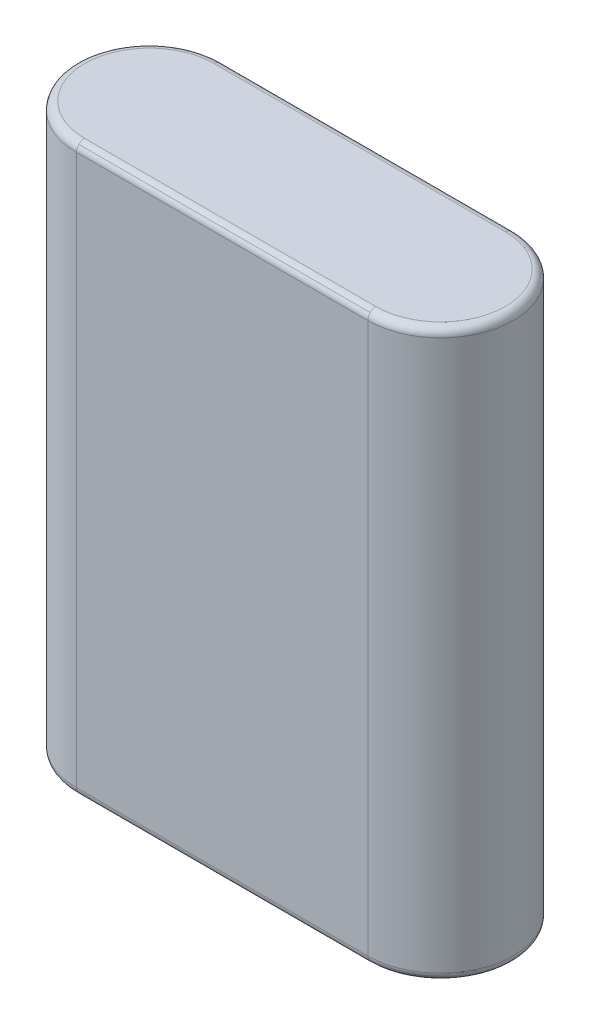
ISO-10303-21;
HEADER;
FILE_DESCRIPTION(('STEP AP214'),'2;1');
FILE_NAME('part.step','',(''),(''),'','','');
FILE_SCHEMA(('AUTOMOTIVE_DESIGN { 1 0 10303 214 1 1 1 1 }'));
ENDSEC;
DATA;
#1=APPLICATION_CONTEXT('core data for automotive mechanical design processes');
#2=APPLICATION_PROTOCOL_DEFINITION('international standard','automotive_design',2000,#1);
#3=PRODUCT_CONTEXT('',#1,'mechanical');
#4=PRODUCT('Part','Part','',(#3));
#5=PRODUCT_RELATED_PRODUCT_CATEGORY('part','',(#4));
#6=PRODUCT_DEFINITION_FORMATION('','',#4);
#7=PRODUCT_DEFINITION_CONTEXT('part definition',#1,'design');
#8=PRODUCT_DEFINITION('design','',#6,#7);
#9=PRODUCT_DEFINITION_SHAPE('','',#8);
#10=(LENGTH_UNIT() NAMED_UNIT(*) SI_UNIT(.MILLI.,.METRE.));
#11=(NAMED_UNIT(*) PLANE_ANGLE_UNIT() SI_UNIT($,.RADIAN.));
#12=(NAMED_UNIT(*) SI_UNIT($,.STERADIAN.) SOLID_ANGLE_UNIT());
#13=UNCERTAINTY_MEASURE_WITH_UNIT(LENGTH_MEASURE(1.E-05),#10,'distance_accuracy_value','');
#14=(GEOMETRIC_REPRESENTATION_CONTEXT(3) GLOBAL_UNCERTAINTY_ASSIGNED_CONTEXT((#13)) GLOBAL_UNIT_ASSIGNED_CONTEXT((#10,
#11,#12)) REPRESENTATION_CONTEXT('',''));
#15=CARTESIAN_POINT('',(0.,0.,0.));
#16=DIRECTION('',(0.,0.,1.));
#17=DIRECTION('',(1.,0.,0.));
#18=AXIS2_PLACEMENT_3D('',#15,#16,#17);
#19=CARTESIAN_POINT('',(46.0000052846952,0.999999616823802,-4.59004528540359));
#20=DIRECTION('',(-0.999999999999999,4.37113879999998E-08,0.));
#21=DIRECTION('',(-3.09086187435651E-08,-0.707106843003753,0.707106719369337));
#22=AXIS2_PLACEMENT_3D('',#19,#20,#21);
#23=CYLINDRICAL_SURFACE('',#22,1.);
#24=DIRECTION('',(-0.999999999999999,4.37113879999998E-08,0.));
#25=VECTOR('',#24,1.);
#26=CARTESIAN_POINT('',(46.0000052537866,0.292892773819609,-3.8829385660338));
#27=LINE('',#26,#25);
#28=CARTESIAN_POINT('',(50.5000052537866,0.292892577118356,-3.88293856603382));
#29=VERTEX_POINT('',#28);
#30=CARTESIAN_POINT('',(14.5000052537866,0.292894150728321,-3.88293856603367));
#31=VERTEX_POINT('',#30);
#32=EDGE_CURVE('E209',#29,#31,#27,.T.);
#33=ORIENTED_EDGE('',*,*,#32,.F.);
#34=CARTESIAN_POINT('',(50.5000052846952,0.999999420122549,-4.59004528540361));
#35=DIRECTION('',(-0.999999999999999,4.37113879999998E-08,0.));
#36=DIRECTION('',(-4.3711388E-08,-0.999999999999995,-8.7422734E-08));
#37=AXIS2_PLACEMENT_3D('',#34,#35,#36);
#38=CIRCLE('',#37,1.);
#39=CARTESIAN_POINT('',(50.5000052846952,0.999999332699814,-3.59004528540361));
#40=VERTEX_POINT('',#39);
#41=EDGE_CURVE('E191',#29,#40,#38,.T.);
#42=ORIENTED_EDGE('',*,*,#41,.T.);
#43=DIRECTION('',(-0.999999999999999,4.37113879999998E-08,0.));
#44=VECTOR('',#43,1.);
#45=CARTESIAN_POINT('',(46.0000052846952,0.999999529401066,-3.59004528540359));
#46=LINE('',#45,#44);
#47=CARTESIAN_POINT('',(14.5000052846953,1.00000090630978,-3.59004528540347));
#48=VERTEX_POINT('',#47);
#49=EDGE_CURVE('E202',#40,#48,#46,.T.);
#50=ORIENTED_EDGE('',*,*,#49,.T.);
#51=CARTESIAN_POINT('',(14.5000052846953,1.00000099373251,-4.59004528540346));
#52=DIRECTION('',(0.999999999999999,-4.37113879999998E-08,0.));
#53=DIRECTION('',(0.,-8.74227340000001E-08,0.999999999999996));
#54=AXIS2_PLACEMENT_3D('',#51,#52,#53);
#55=CIRCLE('',#54,1.);
#56=EDGE_CURVE('E11',#48,#31,#55,.T.);
#57=ORIENTED_EDGE('',*,*,#56,.T.);
#58=EDGE_LOOP('',(#33,#42,#50,#57));
#59=FACE_BOUND('',#58,.T.);
#60=ADVANCED_FACE('F17',(#59),#23,.T.);
#61=CARTESIAN_POINT('',(14.5000052846953,1.00000169311439,-12.5900452854034));
#62=DIRECTION('',(4.3711388E-08,0.999999999999995,8.7422734E-08));
#63=DIRECTION('',(0.,8.74227340000001E-08,-0.999999999999996));
#64=AXIS2_PLACEMENT_3D('',#61,#62,#63);
#65=TOROIDAL_SURFACE('',#64,8.,1.);
#66=CARTESIAN_POINT('',(14.5000052846953,1.00000239249626,-20.5900452854034));
#67=DIRECTION('',(-0.999999999999999,4.37113879999998E-08,0.));
#68=DIRECTION('',(0.,8.74227340000001E-08,-0.999999999999996));
#69=AXIS2_PLACEMENT_3D('',#66,#67,#68);
#70=CIRCLE('',#69,1.);
#71=CARTESIAN_POINT('',(14.5000052846953,1.00000247991899,-21.5900452854034));
#72=VERTEX_POINT('',#71);
#73=CARTESIAN_POINT('',(14.5000052537866,0.292895673126473,-21.2971521284076));
#74=VERTEX_POINT('',#73);
#75=EDGE_CURVE('E162',#72,#74,#70,.T.);
#76=ORIENTED_EDGE('',*,*,#75,.T.);
#77=CARTESIAN_POINT('',(14.5000052846953,1.00000239249626,-20.5900452854034));
#78=DIRECTION('',(-0.999999999999999,4.37113879999998E-08,0.));
#79=DIRECTION('',(0.,8.74227340000001E-08,-0.999999999999996));
#80=AXIS2_PLACEMENT_3D('',#77,#78,#79);
#81=CIRCLE('',#80,1.);
#82=CARTESIAN_POINT('',(14.5000052409839,2.3924962566646E-06,-20.5900453728261));
#83=VERTEX_POINT('',#82);
#84=EDGE_CURVE('E28',#74,#83,#81,.T.);
#85=ORIENTED_EDGE('',*,*,#84,.T.);
#86=CARTESIAN_POINT('',(14.5000052409839,1.69311438480424E-06,-12.5900453728262));
#87=DIRECTION('',(4.3711388E-08,0.999999999999995,8.7422734E-08));
#88=DIRECTION('',(-0.999999999999999,4.37113879999998E-08,0.));
#89=AXIS2_PLACEMENT_3D('',#86,#87,#88);
#90=CIRCLE('',#89,8.);
#91=CARTESIAN_POINT('',(14.5000052409839,9.93732512943879E-07,-4.5900453728262));
#92=VERTEX_POINT('',#91);
#93=EDGE_CURVE('E116',#83,#92,#90,.T.);
#94=ORIENTED_EDGE('',*,*,#93,.T.);
#95=CARTESIAN_POINT('',(14.5000052846953,1.00000099373251,-4.59004528540346));
#96=DIRECTION('',(0.999999999999999,-4.37113879999998E-08,0.));
#97=DIRECTION('',(0.,-8.74227340000001E-08,0.999999999999996));
#98=AXIS2_PLACEMENT_3D('',#95,#96,#97);
#99=CIRCLE('',#98,1.);
#100=EDGE_CURVE('E213',#31,#92,#99,.T.);
#101=ORIENTED_EDGE('',*,*,#100,.F.);
#102=ORIENTED_EDGE('',*,*,#56,.F.);
#103=CARTESIAN_POINT('',(14.5000052846953,1.00000169311439,-12.5900452854034));
#104=DIRECTION('',(-4.3711388E-08,-0.999999999999995,-8.7422734E-08));
#105=DIRECTION('',(-0.999999999999999,4.37113879999998E-08,0.));
#106=AXIS2_PLACEMENT_3D('',#103,#104,#105);
#107=CIRCLE('',#106,9.);
#108=CARTESIAN_POINT('',(8.13604425401627,1.00000252764683,-18.9540063160824));
#109=VERTEX_POINT('',#108);
#110=EDGE_CURVE('E193',#48,#109,#107,.T.);
#111=ORIENTED_EDGE('',*,*,#110,.T.);
#112=CARTESIAN_POINT('',(14.5000052846953,1.00000169311439,-12.5900452854034));
#113=DIRECTION('',(-4.3711388E-08,-0.999999999999995,-8.7422734E-08));
#114=DIRECTION('',(-0.999999999999999,4.37113879999998E-08,0.));
#115=AXIS2_PLACEMENT_3D('',#112,#113,#114);
#116=CIRCLE('',#115,9.);
#117=EDGE_CURVE('E226',#109,#72,#116,.T.);
#118=ORIENTED_EDGE('',*,*,#117,.T.);
#119=EDGE_LOOP('',(#76,#85,#94,#101,#102,#111,#118));
#120=FACE_BOUND('',#119,.T.);
#121=ADVANCED_FACE('F159',(#120),#65,.T.);
#122=CARTESIAN_POINT('',(46.0000052846952,1.00000101558755,-20.5900452854035));
#123=DIRECTION('',(-0.999999999999999,4.37113879999998E-08,0.));
#124=DIRECTION('',(-3.09086189961875E-08,-0.707106719369337,-0.707106843003753));
#125=AXIS2_PLACEMENT_3D('',#122,#123,#124);
#126=CYLINDRICAL_SURFACE('',#125,1.);
#127=DIRECTION('',(-0.999999999999999,4.37113879999998E-08,0.));
#128=VECTOR('',#127,1.);
#129=CARTESIAN_POINT('',(46.0000052537866,0.292894296217761,-21.2971521284077));
#130=LINE('',#129,#128);
#131=CARTESIAN_POINT('',(50.5000052537866,0.292894099516508,-21.2971521284077));
#132=VERTEX_POINT('',#131);
#133=EDGE_CURVE('E293',#132,#74,#130,.T.);
#134=ORIENTED_EDGE('',*,*,#133,.F.);
#135=CARTESIAN_POINT('',(50.5000052846952,1.00000081888629,-20.5900452854035));
#136=DIRECTION('',(-0.999999999999999,4.37113879999998E-08,0.));
#137=DIRECTION('',(0.,8.74227340000001E-08,-0.999999999999996));
#138=AXIS2_PLACEMENT_3D('',#135,#136,#137);
#139=CIRCLE('',#138,1.);
#140=CARTESIAN_POINT('',(50.5000052409838,8.188862921088E-07,-20.5900453728263));
#141=VERTEX_POINT('',#140);
#142=EDGE_CURVE('E167',#132,#141,#139,.T.);
#143=ORIENTED_EDGE('',*,*,#142,.T.);
#144=DIRECTION('',(-0.999999999999999,4.37113879999998E-08,0.));
#145=VECTOR('',#144,1.);
#146=CARTESIAN_POINT('',(46.0000052409838,1.01558754461717E-06,-20.5900453728263));
#147=LINE('',#146,#145);
#148=EDGE_CURVE('E170',#141,#83,#147,.T.);
#149=ORIENTED_EDGE('',*,*,#148,.T.);
#150=ORIENTED_EDGE('',*,*,#84,.F.);
#151=EDGE_LOOP('',(#134,#143,#149,#150));
#152=FACE_BOUND('',#151,.T.);
#153=ADVANCED_FACE('F171',(#152),#126,.T.);
#154=CARTESIAN_POINT('',(50.5000052846952,1.00000011950442,-12.5900452854036));
#155=DIRECTION('',(4.3711388E-08,0.999999999999995,8.7422734E-08));
#156=DIRECTION('',(0.,8.74227340000001E-08,-0.999999999999996));
#157=AXIS2_PLACEMENT_3D('',#154,#155,#156);
#158=TOROIDAL_SURFACE('',#157,8.,1.);
#159=CARTESIAN_POINT('',(50.5000052846952,1.00000081888629,-20.5900452854035));
#160=DIRECTION('',(-0.999999999999999,4.37113879999998E-08,0.));
#161=DIRECTION('',(0.,8.74227340000001E-08,-0.999999999999996));
#162=AXIS2_PLACEMENT_3D('',#159,#160,#161);
#163=CIRCLE('',#162,1.);
#164=CARTESIAN_POINT('',(50.5000052846952,1.00000090630903,-21.5900452854035));
#165=VERTEX_POINT('',#164);
#166=EDGE_CURVE('E229',#165,#132,#163,.T.);
#167=ORIENTED_EDGE('',*,*,#166,.F.);
#168=CARTESIAN_POINT('',(50.5000052846952,1.00000011950442,-12.5900452854036));
#169=DIRECTION('',(-4.3711388E-08,-0.999999999999995,-8.7422734E-08));
#170=DIRECTION('',(0.999999999999999,-4.37113879999998E-08,0.));
#171=AXIS2_PLACEMENT_3D('',#168,#169,#170);
#172=CIRCLE('',#171,9.);
#173=CARTESIAN_POINT('',(56.8639663153742,1.00000039768172,-18.9540063160826));
#174=VERTEX_POINT('',#173);
#175=EDGE_CURVE('E208',#165,#174,#172,.T.);
#176=ORIENTED_EDGE('',*,*,#175,.T.);
#177=CARTESIAN_POINT('',(50.5000052846952,1.00000011950442,-12.5900452854036));
#178=DIRECTION('',(-4.3711388E-08,-0.999999999999995,-8.7422734E-08));
#179=DIRECTION('',(0.999999999999999,-4.37113879999998E-08,0.));
#180=AXIS2_PLACEMENT_3D('',#177,#178,#179);
#181=CIRCLE('',#180,9.);
#182=EDGE_CURVE('E234',#174,#40,#181,.T.);
#183=ORIENTED_EDGE('',*,*,#182,.T.);
#184=ORIENTED_EDGE('',*,*,#41,.F.);
#185=CARTESIAN_POINT('',(50.5000052846952,0.999999420122549,-4.59004528540361));
#186=DIRECTION('',(-0.999999999999999,4.37113879999998E-08,0.));
#187=DIRECTION('',(-4.3711388E-08,-0.999999999999995,-8.7422734E-08));
#188=AXIS2_PLACEMENT_3D('',#185,#186,#187);
#189=CIRCLE('',#188,1.);
#190=CARTESIAN_POINT('',(50.5000052409838,-5.79877451611921E-07,-4.59004537282634));
#191=VERTEX_POINT('',#190);
#192=EDGE_CURVE('E214',#191,#29,#189,.T.);
#193=ORIENTED_EDGE('',*,*,#192,.F.);
#194=CARTESIAN_POINT('',(50.5000052409838,1.1950442024844E-07,-12.5900453728263));
#195=DIRECTION('',(4.3711388E-08,0.999999999999995,8.7422734E-08));
#196=DIRECTION('',(0.999999999999999,-4.37113879999998E-08,0.));
#197=AXIS2_PLACEMENT_3D('',#194,#195,#196);
#198=CIRCLE('',#197,8.);
#199=EDGE_CURVE('E175',#191,#141,#198,.T.);
#200=ORIENTED_EDGE('',*,*,#199,.T.);
#201=ORIENTED_EDGE('',*,*,#142,.F.);
#202=EDGE_LOOP('',(#167,#176,#183,#184,#193,#200,#201));
#203=FACE_BOUND('',#202,.T.);
#204=ADVANCED_FACE('F370',(#203),#158,.T.);
#205=CARTESIAN_POINT('',(14.5000060059332,17.5000016931143,-12.5900438429283));
#206=DIRECTION('',(4.3711388E-08,0.999999999999995,8.7422734E-08));
#207=DIRECTION('',(-0.707106781186547,9.2725826911144E-08,-0.707106781186542));
#208=AXIS2_PLACEMENT_3D('',#205,#206,#207);
#209=CYLINDRICAL_SURFACE('',#208,9.);
#210=DIRECTION('',(4.3711388E-08,0.999999999999995,8.7422734E-08));
#211=VECTOR('',#210,1.);
#212=CARTESIAN_POINT('',(8.13604497525418,17.5000025276468,-18.9540048736073));
#213=LINE('',#212,#211);
#214=CARTESIAN_POINT('',(8.13604722639066,69.0000025276465,-18.9540003713365));
#215=VERTEX_POINT('',#214);
#216=EDGE_CURVE('E221',#109,#215,#213,.T.);
#217=ORIENTED_EDGE('',*,*,#216,.F.);
#218=ORIENTED_EDGE('',*,*,#110,.F.);
#219=DIRECTION('',(4.3711388E-08,0.999999999999995,8.7422734E-08));
#220=VECTOR('',#219,1.);
#221=CARTESIAN_POINT('',(14.5000060059332,17.5000009063097,-3.59004384292835));
#222=LINE('',#221,#220);
#223=CARTESIAN_POINT('',(14.5000082570697,69.0000009063095,-3.59003934065755));
#224=VERTEX_POINT('',#223);
#225=EDGE_CURVE('E153',#48,#224,#222,.T.);
#226=ORIENTED_EDGE('',*,*,#225,.T.);
#227=CARTESIAN_POINT('',(14.5000082570697,69.0000016931141,-12.5900393406575));
#228=DIRECTION('',(4.3711388E-08,0.999999999999995,8.7422734E-08));
#229=DIRECTION('',(-0.999999999999999,4.37113879999998E-08,0.));
#230=AXIS2_PLACEMENT_3D('',#227,#228,#229);
#231=CIRCLE('',#230,9.);
#232=EDGE_CURVE('E230',#215,#224,#231,.T.);
#233=ORIENTED_EDGE('',*,*,#232,.F.);
#234=EDGE_LOOP('',(#217,#218,#226,#233));
#235=FACE_BOUND('',#234,.T.);
#236=ADVANCED_FACE('F316',(#235),#209,.T.);
#237=CARTESIAN_POINT('',(32.5000067708824,35.0000001195046,-3.59004231303058));
#238=DIRECTION('',(0.,8.74227340000001E-08,-0.999999999999996));
#239=DIRECTION('',(-4.3711388E-08,-0.999999999999995,-8.7422734E-08));
#240=AXIS2_PLACEMENT_3D('',#237,#238,#239);
#241=PLANE('',#240);
#242=ORIENTED_EDGE('',*,*,#49,.F.);
#243=DIRECTION('',(-4.3711388E-08,-0.999999999999995,-8.7422734E-08));
#244=VECTOR('',#243,1.);
#245=CARTESIAN_POINT('',(50.5000075358317,52.4999993326996,-3.59004078313281));
#246=LINE('',#245,#244);
#247=CARTESIAN_POINT('',(50.5000082570696,68.9999993326995,-3.5900393406577));
#248=VERTEX_POINT('',#247);
#249=EDGE_CURVE('E200',#248,#40,#246,.T.);
#250=ORIENTED_EDGE('',*,*,#249,.F.);
#251=DIRECTION('',(0.999999999999999,-4.37113879999998E-08,0.));
#252=VECTOR('',#251,1.);
#253=CARTESIAN_POINT('',(19.0000082570696,69.0000007096082,-3.59003934065757));
#254=LINE('',#253,#252);
#255=EDGE_CURVE('E182',#224,#248,#254,.T.);
#256=ORIENTED_EDGE('',*,*,#255,.F.);
#257=ORIENTED_EDGE('',*,*,#225,.F.);
#258=EDGE_LOOP('',(#242,#250,#256,#257));
#259=FACE_BOUND('',#258,.T.);
#260=ADVANCED_FACE('F380',(#259),#241,.F.);
#261=CARTESIAN_POINT('',(59.5000052409838,-1.06070267846814E-06,-3.59004537282638));
#262=DIRECTION('',(-4.3711388E-08,-0.999999999999995,-8.7422734E-08));
#263=DIRECTION('',(-0.999999999999999,4.37113879999998E-08,0.));
#264=AXIS2_PLACEMENT_3D('',#261,#262,#263);
#265=PLANE('',#264);
#266=DIRECTION('',(0.999999999999999,-4.37113879999998E-08,0.));
#267=VECTOR('',#266,1.);
#268=CARTESIAN_POINT('',(46.0000052409839,-3.83176199103552E-07,-4.59004537282632));
#269=LINE('',#268,#267);
#270=EDGE_CURVE('E179',#92,#191,#269,.T.);
#271=ORIENTED_EDGE('',*,*,#270,.F.);
#272=ORIENTED_EDGE('',*,*,#93,.F.);
#273=ORIENTED_EDGE('',*,*,#148,.F.);
#274=ORIENTED_EDGE('',*,*,#199,.F.);
#275=EDGE_LOOP('',(#271,#272,#273,#274));
#276=FACE_BOUND('',#275,.T.);
#277=ADVANCED_FACE('F177',(#276),#265,.T.);
#278=CARTESIAN_POINT('',(19.0000082570696,69.0000007970309,-4.59003934065757));
#279=DIRECTION('',(0.999999999999999,-4.37113879999998E-08,0.));
#280=DIRECTION('',(3.09086189961875E-08,0.707106719369337,0.707106843003753));
#281=AXIS2_PLACEMENT_3D('',#278,#279,#280);
#282=CYLINDRICAL_SURFACE('',#281,1.);
#283=DIRECTION('',(0.999999999999999,-4.37113879999998E-08,0.));
#284=VECTOR('',#283,1.);
#285=CARTESIAN_POINT('',(19.0000082879783,69.7071075164007,-3.88293249765336));
#286=LINE('',#285,#284);
#287=CARTESIAN_POINT('',(14.5000082879783,69.707107713102,-3.88293249765334));
#288=VERTEX_POINT('',#287);
#289=CARTESIAN_POINT('',(50.5000082879782,69.707106139492,-3.88293249765349));
#290=VERTEX_POINT('',#289);
#291=EDGE_CURVE('E247',#288,#290,#286,.T.);
#292=ORIENTED_EDGE('',*,*,#291,.F.);
#293=CARTESIAN_POINT('',(14.5000082570697,69.0000009937322,-4.59003934065755));
#294=DIRECTION('',(0.999999999999999,-4.37113879999998E-08,0.));
#295=DIRECTION('',(4.3711388E-08,0.999999999999995,8.7422734E-08));
#296=AXIS2_PLACEMENT_3D('',#293,#294,#295);
#297=CIRCLE('',#296,1.);
#298=EDGE_CURVE('E233',#288,#224,#297,.T.);
#299=ORIENTED_EDGE('',*,*,#298,.T.);
#300=ORIENTED_EDGE('',*,*,#255,.T.);
#301=CARTESIAN_POINT('',(50.5000082570696,68.9999994201222,-4.59003934065769));
#302=DIRECTION('',(-0.999999999999999,4.37113879999998E-08,0.));
#303=DIRECTION('',(0.,-8.74227340000001E-08,0.999999999999996));
#304=AXIS2_PLACEMENT_3D('',#301,#302,#303);
#305=CIRCLE('',#304,1.);
#306=EDGE_CURVE('E187',#248,#290,#305,.T.);
#307=ORIENTED_EDGE('',*,*,#306,.T.);
#308=EDGE_LOOP('',(#292,#299,#300,#307));
#309=FACE_BOUND('',#308,.T.);
#310=ADVANCED_FACE('F306',(#309),#282,.T.);
#311=CARTESIAN_POINT('',(50.5000082570696,69.0000001195041,-12.5900393406577));
#312=DIRECTION('',(-4.3711388E-08,-0.999999999999995,-8.7422734E-08));
#313=DIRECTION('',(0.,-8.74227340000001E-08,0.999999999999996));
#314=AXIS2_PLACEMENT_3D('',#311,#312,#313);
#315=TOROIDAL_SURFACE('',#314,8.,1.);
#316=CARTESIAN_POINT('',(50.5000082570696,69.000000818886,-20.5900393406576));
#317=DIRECTION('',(0.999999999999999,-4.37113879999998E-08,0.));
#318=DIRECTION('',(0.,8.74227340000001E-08,-0.999999999999996));
#319=AXIS2_PLACEMENT_3D('',#316,#317,#318);
#320=CIRCLE('',#319,1.);
#321=CARTESIAN_POINT('',(50.5000082570696,69.0000009063087,-21.5900393406576));
#322=VERTEX_POINT('',#321);
#323=CARTESIAN_POINT('',(50.5000082879782,69.7071076618902,-21.2971460600274));
#324=VERTEX_POINT('',#323);
#325=EDGE_CURVE('E240',#322,#324,#320,.T.);
#326=ORIENTED_EDGE('',*,*,#325,.T.);
#327=CARTESIAN_POINT('',(50.5000082570696,69.000000818886,-20.5900393406576));
#328=DIRECTION('',(0.999999999999999,-4.37113879999998E-08,0.));
#329=DIRECTION('',(0.,8.74227340000001E-08,-0.999999999999996));
#330=AXIS2_PLACEMENT_3D('',#327,#328,#329);
#331=CIRCLE('',#330,1.);
#332=CARTESIAN_POINT('',(50.500008300781,70.000000818886,-20.5900392532349));
#333=VERTEX_POINT('',#332);
#334=EDGE_CURVE('E195',#324,#333,#331,.T.);
#335=ORIENTED_EDGE('',*,*,#334,.T.);
#336=CARTESIAN_POINT('',(50.500008300781,70.0000001195041,-12.5900392532349));
#337=DIRECTION('',(-4.3711388E-08,-0.999999999999995,-8.7422734E-08));
#338=DIRECTION('',(0.999999999999999,-4.37113879999998E-08,0.));
#339=AXIS2_PLACEMENT_3D('',#336,#337,#338);
#340=CIRCLE('',#339,8.);
#341=CARTESIAN_POINT('',(50.500008300781,69.9999994201222,-4.59003925323496));
#342=VERTEX_POINT('',#341);
#343=EDGE_CURVE('E21',#333,#342,#340,.T.);
#344=ORIENTED_EDGE('',*,*,#343,.T.);
#345=CARTESIAN_POINT('',(50.5000082570696,68.9999994201222,-4.59003934065769));
#346=DIRECTION('',(-0.999999999999999,4.37113879999998E-08,0.));
#347=DIRECTION('',(0.,-8.74227340000001E-08,0.999999999999996));
#348=AXIS2_PLACEMENT_3D('',#345,#346,#347);
#349=CIRCLE('',#348,1.);
#350=EDGE_CURVE('E220',#290,#342,#349,.T.);
#351=ORIENTED_EDGE('',*,*,#350,.F.);
#352=ORIENTED_EDGE('',*,*,#306,.F.);
#353=CARTESIAN_POINT('',(50.5000082570696,69.0000001195041,-12.5900393406577));
#354=DIRECTION('',(4.3711388E-08,0.999999999999995,8.7422734E-08));
#355=DIRECTION('',(0.999999999999999,-4.37113879999998E-08,0.));
#356=AXIS2_PLACEMENT_3D('',#353,#354,#355);
#357=CIRCLE('',#356,9.);
#358=CARTESIAN_POINT('',(56.8639692877486,69.0000003976814,-18.9540003713367));
#359=VERTEX_POINT('',#358);
#360=EDGE_CURVE('E197',#248,#359,#357,.T.);
#361=ORIENTED_EDGE('',*,*,#360,.T.);
#362=CARTESIAN_POINT('',(50.5000082570696,69.0000001195041,-12.5900393406577));
#363=DIRECTION('',(4.3711388E-08,0.999999999999995,8.7422734E-08));
#364=DIRECTION('',(0.999999999999999,-4.37113879999998E-08,0.));
#365=AXIS2_PLACEMENT_3D('',#362,#363,#364);
#366=CIRCLE('',#365,9.);
#367=EDGE_CURVE('E250',#359,#322,#366,.T.);
#368=ORIENTED_EDGE('',*,*,#367,.T.);
#369=EDGE_LOOP('',(#326,#335,#344,#351,#352,#361,#368));
#370=FACE_BOUND('',#369,.T.);
#371=ADVANCED_FACE('F417',(#370),#315,.T.);
#372=CARTESIAN_POINT('',(19.0000082570696,69.0000021957947,-20.5900393406575));
#373=DIRECTION('',(0.999999999999999,-4.37113879999998E-08,0.));
#374=DIRECTION('',(3.09086187435651E-08,0.707106843003753,-0.707106719369337));
#375=AXIS2_PLACEMENT_3D('',#372,#373,#374);
#376=CYLINDRICAL_SURFACE('',#375,1.);
#377=DIRECTION('',(0.999999999999999,-4.37113879999998E-08,0.));
#378=VECTOR('',#377,1.);
#379=CARTESIAN_POINT('',(19.0000082879783,69.7071090387989,-21.2971460600273));
#380=LINE('',#379,#378);
#381=CARTESIAN_POINT('',(14.5000082879783,69.7071092355001,-21.2971460600273));
#382=VERTEX_POINT('',#381);
#383=EDGE_CURVE('E236',#382,#324,#380,.T.);
#384=ORIENTED_EDGE('',*,*,#383,.F.);
#385=CARTESIAN_POINT('',(14.5000082570697,69.0000023924959,-20.5900393406575));
#386=DIRECTION('',(0.999999999999999,-4.37113879999998E-08,0.));
#387=DIRECTION('',(0.,8.74227383368088E-08,-0.999999999999996));
#388=AXIS2_PLACEMENT_3D('',#385,#386,#387);
#389=CIRCLE('',#388,1.);
#390=CARTESIAN_POINT('',(14.500008300781,70.0000023924959,-20.5900392532348));
#391=VERTEX_POINT('',#390);
#392=EDGE_CURVE('E268',#382,#391,#389,.T.);
#393=ORIENTED_EDGE('',*,*,#392,.T.);
#394=DIRECTION('',(0.999999999999999,-4.37113879999998E-08,0.));
#395=VECTOR('',#394,1.);
#396=CARTESIAN_POINT('',(19.000008300781,70.0000021957947,-20.5900392532348));
#397=LINE('',#396,#395);
#398=EDGE_CURVE('E336',#391,#333,#397,.T.);
#399=ORIENTED_EDGE('',*,*,#398,.T.);
#400=ORIENTED_EDGE('',*,*,#334,.F.);
#401=EDGE_LOOP('',(#384,#393,#399,#400));
#402=FACE_BOUND('',#401,.T.);
#403=ADVANCED_FACE('F414',(#402),#376,.T.);
#404=CARTESIAN_POINT('',(14.5000082570697,69.0000016931141,-12.5900393406575));
#405=DIRECTION('',(-4.3711388E-08,-0.999999999999995,-8.7422734E-08));
#406=DIRECTION('',(0.,-8.74227340000001E-08,0.999999999999996));
#407=AXIS2_PLACEMENT_3D('',#404,#405,#406);
#408=TOROIDAL_SURFACE('',#407,8.,1.);
#409=CARTESIAN_POINT('',(14.5000082570697,69.0000023924959,-20.5900393406575));
#410=DIRECTION('',(0.999999999999999,-4.37113879999998E-08,0.));
#411=DIRECTION('',(0.,8.74227383368088E-08,-0.999999999999996));
#412=AXIS2_PLACEMENT_3D('',#409,#410,#411);
#413=CIRCLE('',#412,1.);
#414=CARTESIAN_POINT('',(14.5000082570697,69.0000024799187,-21.5900393406575));
#415=VERTEX_POINT('',#414);
#416=EDGE_CURVE('E219',#415,#382,#413,.T.);
#417=ORIENTED_EDGE('',*,*,#416,.F.);
#418=CARTESIAN_POINT('',(14.5000082570697,69.0000016931141,-12.5900393406575));
#419=DIRECTION('',(4.3711388E-08,0.999999999999995,8.7422734E-08));
#420=DIRECTION('',(-0.999999999999999,4.37113879999998E-08,0.));
#421=AXIS2_PLACEMENT_3D('',#418,#419,#420);
#422=CIRCLE('',#421,9.);
#423=EDGE_CURVE('E225',#415,#215,#422,.T.);
#424=ORIENTED_EDGE('',*,*,#423,.T.);
#425=ORIENTED_EDGE('',*,*,#232,.T.);
#426=ORIENTED_EDGE('',*,*,#298,.F.);
#427=CARTESIAN_POINT('',(14.5000082570697,69.0000009937322,-4.59003934065755));
#428=DIRECTION('',(0.999999999999999,-4.37113879999998E-08,0.));
#429=DIRECTION('',(4.3711388E-08,0.999999999999995,8.7422734E-08));
#430=AXIS2_PLACEMENT_3D('',#427,#428,#429);
#431=CIRCLE('',#430,1.);
#432=CARTESIAN_POINT('',(14.500008300781,70.0000009937322,-4.59003925323482));
#433=VERTEX_POINT('',#432);
#434=EDGE_CURVE('E259',#433,#288,#431,.T.);
#435=ORIENTED_EDGE('',*,*,#434,.F.);
#436=CARTESIAN_POINT('',(14.500008300781,70.0000016931141,-12.5900392532348));
#437=DIRECTION('',(-4.3711388E-08,-0.999999999999995,-8.7422734E-08));
#438=DIRECTION('',(-0.999999999999999,4.37113879999998E-08,0.));
#439=AXIS2_PLACEMENT_3D('',#436,#437,#438);
#440=CIRCLE('',#439,8.);
#441=EDGE_CURVE('E201',#433,#391,#440,.T.);
#442=ORIENTED_EDGE('',*,*,#441,.T.);
#443=ORIENTED_EDGE('',*,*,#392,.F.);
#444=EDGE_LOOP('',(#417,#424,#425,#426,#435,#442,#443));
#445=FACE_BOUND('',#444,.T.);
#446=ADVANCED_FACE('F311',(#445),#408,.T.);
#447=CARTESIAN_POINT('',(50.5000075358317,52.5000001195042,-12.5900407831328));
#448=DIRECTION('',(-4.3711388E-08,-0.999999999999995,-8.7422734E-08));
#449=DIRECTION('',(0.707106781186547,3.09085891713917E-08,-0.707106781186548));
#450=AXIS2_PLACEMENT_3D('',#447,#448,#449);
#451=CYLINDRICAL_SURFACE('',#450,9.);
#452=DIRECTION('',(-4.3711388E-08,-0.999999999999995,-8.7422734E-08));
#453=VECTOR('',#452,1.);
#454=CARTESIAN_POINT('',(56.8639685665107,52.5000003976815,-18.9540018138118));
#455=LINE('',#454,#453);
#456=EDGE_CURVE('E254',#359,#174,#455,.T.);
#457=ORIENTED_EDGE('',*,*,#456,.F.);
#458=ORIENTED_EDGE('',*,*,#360,.F.);
#459=ORIENTED_EDGE('',*,*,#249,.T.);
#460=ORIENTED_EDGE('',*,*,#182,.F.);
#461=EDGE_LOOP('',(#457,#458,#459,#460));
#462=FACE_BOUND('',#461,.T.);
#463=ADVANCED_FACE('F377',(#462),#451,.T.);
#464=CARTESIAN_POINT('',(5.50000830078105,70.0000012997119,-3.59003925323478));
#465=DIRECTION('',(4.3711388E-08,0.999999999999995,8.7422734E-08));
#466=DIRECTION('',(0.,8.74227340000001E-08,-0.999999999999996));
#467=AXIS2_PLACEMENT_3D('',#464,#465,#466);
#468=PLANE('',#467);
#469=DIRECTION('',(-0.999999999999999,4.37113879999998E-08,0.));
#470=VECTOR('',#469,1.);
#471=CARTESIAN_POINT('',(19.000008300781,70.0000007970309,-4.59003925323483));
#472=LINE('',#471,#470);
#473=EDGE_CURVE('E215',#342,#433,#472,.T.);
#474=ORIENTED_EDGE('',*,*,#473,.F.);
#475=ORIENTED_EDGE('',*,*,#343,.F.);
#476=ORIENTED_EDGE('',*,*,#398,.F.);
#477=ORIENTED_EDGE('',*,*,#441,.F.);
#478=EDGE_LOOP('',(#474,#475,#476,#477));
#479=FACE_BOUND('',#478,.T.);
#480=ADVANCED_FACE('F406',(#479),#468,.T.);
#481=CARTESIAN_POINT('',(32.5000067708824,35.0000016931138,-21.5900423130305));
#482=DIRECTION('',(0.,8.74227340000001E-08,-0.999999999999996));
#483=DIRECTION('',(-4.3711388E-08,-0.999999999999995,-8.7422734E-08));
#484=AXIS2_PLACEMENT_3D('',#481,#482,#483);
#485=PLANE('',#484);
#486=DIRECTION('',(0.999999999999999,-4.37113879999998E-08,0.));
#487=VECTOR('',#486,1.);
#488=CARTESIAN_POINT('',(46.0000052846952,1.00000110301028,-21.5900452854035));
#489=LINE('',#488,#487);
#490=EDGE_CURVE('E264',#72,#165,#489,.T.);
#491=ORIENTED_EDGE('',*,*,#490,.F.);
#492=DIRECTION('',(-4.3711388E-08,-0.999999999999995,-8.7422734E-08));
#493=VECTOR('',#492,1.);
#494=CARTESIAN_POINT('',(14.5000060059332,17.5000024799189,-21.5900438429283));
#495=LINE('',#494,#493);
#496=EDGE_CURVE('E256',#415,#72,#495,.T.);
#497=ORIENTED_EDGE('',*,*,#496,.F.);
#498=DIRECTION('',(-0.999999999999999,4.37113879999998E-08,0.));
#499=VECTOR('',#498,1.);
#500=CARTESIAN_POINT('',(19.0000082570696,69.0000022832174,-21.5900393406575));
#501=LINE('',#500,#499);
#502=EDGE_CURVE('E255',#322,#415,#501,.T.);
#503=ORIENTED_EDGE('',*,*,#502,.F.);
#504=DIRECTION('',(4.3711388E-08,0.999999999999995,8.7422734E-08));
#505=VECTOR('',#504,1.);
#506=CARTESIAN_POINT('',(50.5000075358317,52.5000009063088,-21.5900407831327));
#507=LINE('',#506,#505);
#508=EDGE_CURVE('E106',#165,#322,#507,.T.);
#509=ORIENTED_EDGE('',*,*,#508,.F.);
#510=EDGE_LOOP('',(#491,#497,#503,#509));
#511=FACE_BOUND('',#510,.T.);
#512=ADVANCED_FACE('F322',(#511),#485,.T.);
#513=CARTESIAN_POINT('',(50.5000075358317,52.5000001195042,-12.5900407831328));
#514=DIRECTION('',(-4.3711388E-08,-0.999999999999995,-8.7422734E-08));
#515=DIRECTION('',(0.707106781186547,3.09085891713917E-08,-0.707106781186548));
#516=AXIS2_PLACEMENT_3D('',#513,#514,#515);
#517=CYLINDRICAL_SURFACE('',#516,9.);
#518=ORIENTED_EDGE('',*,*,#367,.F.);
#519=ORIENTED_EDGE('',*,*,#456,.T.);
#520=ORIENTED_EDGE('',*,*,#175,.F.);
#521=ORIENTED_EDGE('',*,*,#508,.T.);
#522=EDGE_LOOP('',(#518,#519,#520,#521));
#523=FACE_BOUND('',#522,.T.);
#524=ADVANCED_FACE('F405',(#523),#517,.T.);
#525=CARTESIAN_POINT('',(19.0000082570696,69.0000021957947,-20.5900393406575));
#526=DIRECTION('',(0.999999999999999,-4.37113879999998E-08,0.));
#527=DIRECTION('',(3.09086187435651E-08,0.707106843003753,-0.707106719369337));
#528=AXIS2_PLACEMENT_3D('',#525,#526,#527);
#529=CYLINDRICAL_SURFACE('',#528,1.);
#530=ORIENTED_EDGE('',*,*,#416,.T.);
#531=ORIENTED_EDGE('',*,*,#383,.T.);
#532=ORIENTED_EDGE('',*,*,#325,.F.);
#533=ORIENTED_EDGE('',*,*,#502,.T.);
#534=EDGE_LOOP('',(#530,#531,#532,#533));
#535=FACE_BOUND('',#534,.T.);
#536=ADVANCED_FACE('F411',(#535),#529,.T.);
#537=CARTESIAN_POINT('',(19.0000082570696,69.0000007970309,-4.59003934065757));
#538=DIRECTION('',(0.999999999999999,-4.37113879999998E-08,0.));
#539=DIRECTION('',(3.09086189961875E-08,0.707106719369337,0.707106843003753));
#540=AXIS2_PLACEMENT_3D('',#537,#538,#539);
#541=CYLINDRICAL_SURFACE('',#540,1.);
#542=ORIENTED_EDGE('',*,*,#434,.T.);
#543=ORIENTED_EDGE('',*,*,#291,.T.);
#544=ORIENTED_EDGE('',*,*,#350,.T.);
#545=ORIENTED_EDGE('',*,*,#473,.T.);
#546=EDGE_LOOP('',(#542,#543,#544,#545));
#547=FACE_BOUND('',#546,.T.);
#548=ADVANCED_FACE('F303',(#547),#541,.T.);
#549=CARTESIAN_POINT('',(14.5000060059332,17.5000016931143,-12.5900438429283));
#550=DIRECTION('',(4.3711388E-08,0.999999999999995,8.7422734E-08));
#551=DIRECTION('',(-0.707106781186547,9.2725826911144E-08,-0.707106781186542));
#552=AXIS2_PLACEMENT_3D('',#549,#550,#551);
#553=CYLINDRICAL_SURFACE('',#552,9.);
#554=ORIENTED_EDGE('',*,*,#117,.F.);
#555=ORIENTED_EDGE('',*,*,#216,.T.);
#556=ORIENTED_EDGE('',*,*,#423,.F.);
#557=ORIENTED_EDGE('',*,*,#496,.T.);
#558=EDGE_LOOP('',(#554,#555,#556,#557));
#559=FACE_BOUND('',#558,.T.);
#560=ADVANCED_FACE('F319',(#559),#553,.T.);
#561=CARTESIAN_POINT('',(46.0000052846952,1.00000101558755,-20.5900452854035));
#562=DIRECTION('',(-0.999999999999999,4.37113879999998E-08,0.));
#563=DIRECTION('',(-3.09086189961875E-08,-0.707106719369337,-0.707106843003753));
#564=AXIS2_PLACEMENT_3D('',#561,#562,#563);
#565=CYLINDRICAL_SURFACE('',#564,1.);
#566=ORIENTED_EDGE('',*,*,#166,.T.);
#567=ORIENTED_EDGE('',*,*,#133,.T.);
#568=ORIENTED_EDGE('',*,*,#75,.F.);
#569=ORIENTED_EDGE('',*,*,#490,.T.);
#570=EDGE_LOOP('',(#566,#567,#568,#569));
#571=FACE_BOUND('',#570,.T.);
#572=ADVANCED_FACE('F19',(#571),#565,.T.);
#573=CARTESIAN_POINT('',(46.0000052846952,0.999999616823802,-4.59004528540359));
#574=DIRECTION('',(-0.999999999999999,4.37113879999998E-08,0.));
#575=DIRECTION('',(-3.09086187435651E-08,-0.707106843003753,0.707106719369337));
#576=AXIS2_PLACEMENT_3D('',#573,#574,#575);
#577=CYLINDRICAL_SURFACE('',#576,1.);
#578=ORIENTED_EDGE('',*,*,#192,.T.);
#579=ORIENTED_EDGE('',*,*,#32,.T.);
#580=ORIENTED_EDGE('',*,*,#100,.T.);
#581=ORIENTED_EDGE('',*,*,#270,.T.);
#582=EDGE_LOOP('',(#578,#579,#580,#581));
#583=FACE_BOUND('',#582,.T.);
#584=ADVANCED_FACE('F383',(#583),#577,.T.);
#585=CLOSED_SHELL('',(#60,#121,#153,#204,#236,#260,#277,#310,#371,#403,#446,#463,#480,#512,#524,
#536,#548,#560,#572,#584));
#586=MANIFOLD_SOLID_BREP('B1',#585);
#587=ADVANCED_BREP_SHAPE_REPRESENTATION('',(#18,#586),#14);
#588=SHAPE_DEFINITION_REPRESENTATION(#9,#587);
ENDSEC;
END-ISO-10303-21;
